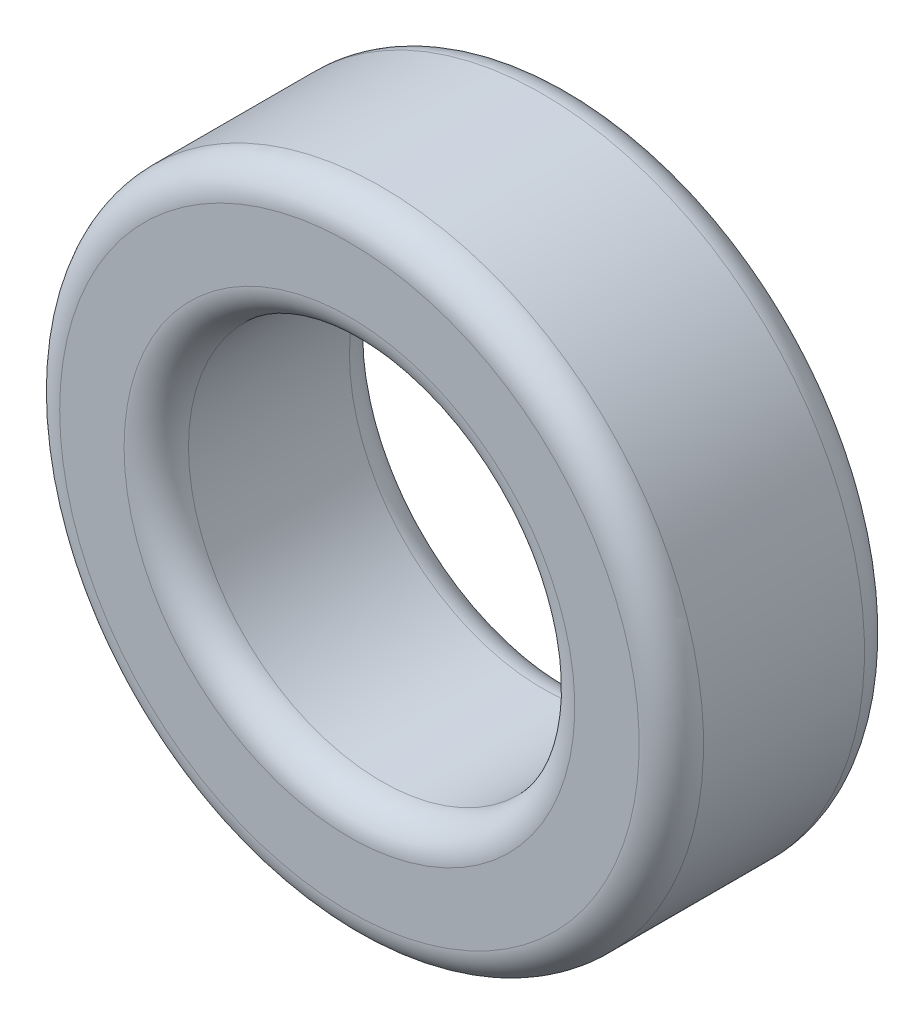
ISO-10303-21;
HEADER;
FILE_DESCRIPTION(('STEP AP214'),'2;1');
FILE_NAME('part.step','',(''),(''),'','','');
FILE_SCHEMA(('AUTOMOTIVE_DESIGN { 1 0 10303 214 1 1 1 1 }'));
ENDSEC;
DATA;
#1=APPLICATION_CONTEXT('core data for automotive mechanical design processes');
#2=APPLICATION_PROTOCOL_DEFINITION('international standard','automotive_design',2000,#1);
#3=PRODUCT_CONTEXT('',#1,'mechanical');
#4=PRODUCT('Part','Part','',(#3));
#5=PRODUCT_RELATED_PRODUCT_CATEGORY('part','',(#4));
#6=PRODUCT_DEFINITION_FORMATION('','',#4);
#7=PRODUCT_DEFINITION_CONTEXT('part definition',#1,'design');
#8=PRODUCT_DEFINITION('design','',#6,#7);
#9=PRODUCT_DEFINITION_SHAPE('','',#8);
#10=(LENGTH_UNIT() NAMED_UNIT(*) SI_UNIT(.MILLI.,.METRE.));
#11=(NAMED_UNIT(*) PLANE_ANGLE_UNIT() SI_UNIT($,.RADIAN.));
#12=(NAMED_UNIT(*) SI_UNIT($,.STERADIAN.) SOLID_ANGLE_UNIT());
#13=UNCERTAINTY_MEASURE_WITH_UNIT(LENGTH_MEASURE(1.E-05),#10,'distance_accuracy_value','');
#14=(GEOMETRIC_REPRESENTATION_CONTEXT(3) GLOBAL_UNCERTAINTY_ASSIGNED_CONTEXT((#13)) GLOBAL_UNIT_ASSIGNED_CONTEXT((#10,
#11,#12)) REPRESENTATION_CONTEXT('',''));
#15=CARTESIAN_POINT('',(0.,0.,0.));
#16=DIRECTION('',(0.,0.,1.));
#17=DIRECTION('',(1.,0.,0.));
#18=AXIS2_PLACEMENT_3D('',#15,#16,#17);
#19=CARTESIAN_POINT('',(0.,0.,1.25));
#20=DIRECTION('',(0.,0.,-1.));
#21=DIRECTION('',(-1.,0.,0.));
#22=AXIS2_PLACEMENT_3D('',#19,#20,#21);
#23=TOROIDAL_SURFACE('',#22,3.5,0.5);
#24=CARTESIAN_POINT('',(0.,0.,1.25));
#25=DIRECTION('',(0.,0.,-1.));
#26=DIRECTION('',(-1.,0.,0.));
#27=AXIS2_PLACEMENT_3D('',#24,#25,#26);
#28=CIRCLE('',#27,3.);
#29=CARTESIAN_POINT('',(-3.,0.,1.25));
#30=VERTEX_POINT('',#29);
#31=EDGE_CURVE('E10',#30,#30,#28,.T.);
#32=ORIENTED_EDGE('',*,*,#31,.T.);
#33=EDGE_LOOP('',(#32));
#34=FACE_BOUND('',#33,.T.);
#35=CARTESIAN_POINT('',(0.,0.,1.75));
#36=DIRECTION('',(0.,0.,-1.));
#37=DIRECTION('',(-1.,0.,0.));
#38=AXIS2_PLACEMENT_3D('',#35,#36,#37);
#39=CIRCLE('',#38,3.5);
#40=CARTESIAN_POINT('',(-3.5,0.,1.75));
#41=VERTEX_POINT('',#40);
#42=EDGE_CURVE('E65',#41,#41,#39,.T.);
#43=ORIENTED_EDGE('',*,*,#42,.F.);
#44=EDGE_LOOP('',(#43));
#45=FACE_BOUND('',#44,.T.);
#46=ADVANCED_FACE('F37',(#34,#45),#23,.T.);
#47=CARTESIAN_POINT('',(0.,0.,0.));
#48=DIRECTION('',(0.,0.,-1.));
#49=DIRECTION('',(-1.,0.,0.));
#50=AXIS2_PLACEMENT_3D('',#47,#48,#49);
#51=CYLINDRICAL_SURFACE('',#50,3.);
#52=CARTESIAN_POINT('',(0.,0.,-1.24999999999999));
#53=DIRECTION('',(0.,0.,-1.));
#54=DIRECTION('',(-1.,0.,0.));
#55=AXIS2_PLACEMENT_3D('',#52,#53,#54);
#56=CIRCLE('',#55,3.);
#57=CARTESIAN_POINT('',(-3.,0.,-1.24999999999999));
#58=VERTEX_POINT('',#57);
#59=EDGE_CURVE('E43',#58,#58,#56,.T.);
#60=ORIENTED_EDGE('',*,*,#59,.T.);
#61=EDGE_LOOP('',(#60));
#62=FACE_BOUND('',#61,.T.);
#63=ORIENTED_EDGE('',*,*,#31,.F.);
#64=EDGE_LOOP('',(#63));
#65=FACE_BOUND('',#64,.T.);
#66=ADVANCED_FACE('F73',(#62,#65),#51,.F.);
#67=CARTESIAN_POINT('',(0.,0.,-1.25));
#68=DIRECTION('',(0.,0.,-1.));
#69=DIRECTION('',(-1.,0.,0.));
#70=AXIS2_PLACEMENT_3D('',#67,#68,#69);
#71=TOROIDAL_SURFACE('',#70,3.5,0.5);
#72=CARTESIAN_POINT('',(0.,0.,-1.75));
#73=DIRECTION('',(0.,0.,-1.));
#74=DIRECTION('',(-1.,0.,0.));
#75=AXIS2_PLACEMENT_3D('',#72,#73,#74);
#76=CIRCLE('',#75,3.5);
#77=CARTESIAN_POINT('',(-3.5,0.,-1.75));
#78=VERTEX_POINT('',#77);
#79=EDGE_CURVE('E47',#78,#78,#76,.T.);
#80=ORIENTED_EDGE('',*,*,#79,.T.);
#81=EDGE_LOOP('',(#80));
#82=FACE_BOUND('',#81,.T.);
#83=ORIENTED_EDGE('',*,*,#59,.F.);
#84=EDGE_LOOP('',(#83));
#85=FACE_BOUND('',#84,.T.);
#86=ADVANCED_FACE('F77',(#82,#85),#71,.T.);
#87=CARTESIAN_POINT('',(0.,4.5,-1.75));
#88=DIRECTION('',(0.,0.,-1.));
#89=DIRECTION('',(-1.,0.,0.));
#90=AXIS2_PLACEMENT_3D('',#87,#88,#89);
#91=PLANE('',#90);
#92=CARTESIAN_POINT('',(0.,0.,-1.75));
#93=DIRECTION('',(0.,0.,-1.));
#94=DIRECTION('',(-1.,0.,0.));
#95=AXIS2_PLACEMENT_3D('',#92,#93,#94);
#96=CIRCLE('',#95,4.5);
#97=CARTESIAN_POINT('',(-4.5,0.,-1.75));
#98=VERTEX_POINT('',#97);
#99=EDGE_CURVE('E51',#98,#98,#96,.T.);
#100=ORIENTED_EDGE('',*,*,#99,.T.);
#101=EDGE_LOOP('',(#100));
#102=FACE_BOUND('',#101,.T.);
#103=ORIENTED_EDGE('',*,*,#79,.F.);
#104=EDGE_LOOP('',(#103));
#105=FACE_BOUND('',#104,.T.);
#106=ADVANCED_FACE('F81',(#102,#105),#91,.T.);
#107=CARTESIAN_POINT('',(0.,0.,-1.25));
#108=DIRECTION('',(0.,0.,-1.));
#109=DIRECTION('',(-1.,0.,0.));
#110=AXIS2_PLACEMENT_3D('',#107,#108,#109);
#111=TOROIDAL_SURFACE('',#110,4.5,0.5);
#112=CARTESIAN_POINT('',(0.,0.,-1.24999999999999));
#113=DIRECTION('',(0.,0.,-1.));
#114=DIRECTION('',(-1.,0.,0.));
#115=AXIS2_PLACEMENT_3D('',#112,#113,#114);
#116=CIRCLE('',#115,5.);
#117=CARTESIAN_POINT('',(-5.,0.,-1.24999999999999));
#118=VERTEX_POINT('',#117);
#119=EDGE_CURVE('E56',#118,#118,#116,.T.);
#120=ORIENTED_EDGE('',*,*,#119,.T.);
#121=EDGE_LOOP('',(#120));
#122=FACE_BOUND('',#121,.T.);
#123=ORIENTED_EDGE('',*,*,#99,.F.);
#124=EDGE_LOOP('',(#123));
#125=FACE_BOUND('',#124,.T.);
#126=ADVANCED_FACE('F88',(#122,#125),#111,.T.);
#127=CARTESIAN_POINT('',(0.,0.,0.));
#128=DIRECTION('',(0.,0.,-1.));
#129=DIRECTION('',(-1.,0.,0.));
#130=AXIS2_PLACEMENT_3D('',#127,#128,#129);
#131=CYLINDRICAL_SURFACE('',#130,5.);
#132=CARTESIAN_POINT('',(0.,0.,1.25));
#133=DIRECTION('',(0.,0.,-1.));
#134=DIRECTION('',(-1.,0.,0.));
#135=AXIS2_PLACEMENT_3D('',#132,#133,#134);
#136=CIRCLE('',#135,5.);
#137=CARTESIAN_POINT('',(-5.,0.,1.25));
#138=VERTEX_POINT('',#137);
#139=EDGE_CURVE('E59',#138,#138,#136,.T.);
#140=ORIENTED_EDGE('',*,*,#139,.T.);
#141=EDGE_LOOP('',(#140));
#142=FACE_BOUND('',#141,.T.);
#143=ORIENTED_EDGE('',*,*,#119,.F.);
#144=EDGE_LOOP('',(#143));
#145=FACE_BOUND('',#144,.T.);
#146=ADVANCED_FACE('F92',(#142,#145),#131,.T.);
#147=CARTESIAN_POINT('',(0.,0.,1.25));
#148=DIRECTION('',(0.,0.,-1.));
#149=DIRECTION('',(-1.,0.,0.));
#150=AXIS2_PLACEMENT_3D('',#147,#148,#149);
#151=TOROIDAL_SURFACE('',#150,4.5,0.5);
#152=CARTESIAN_POINT('',(0.,0.,1.75));
#153=DIRECTION('',(0.,0.,-1.));
#154=DIRECTION('',(-1.,0.,0.));
#155=AXIS2_PLACEMENT_3D('',#152,#153,#154);
#156=CIRCLE('',#155,4.5);
#157=CARTESIAN_POINT('',(-4.5,0.,1.75));
#158=VERTEX_POINT('',#157);
#159=EDGE_CURVE('E62',#158,#158,#156,.T.);
#160=ORIENTED_EDGE('',*,*,#159,.T.);
#161=EDGE_LOOP('',(#160));
#162=FACE_BOUND('',#161,.T.);
#163=ORIENTED_EDGE('',*,*,#139,.F.);
#164=EDGE_LOOP('',(#163));
#165=FACE_BOUND('',#164,.T.);
#166=ADVANCED_FACE('F96',(#162,#165),#151,.T.);
#167=CARTESIAN_POINT('',(0.,4.5,1.75));
#168=DIRECTION('',(0.,0.,1.));
#169=DIRECTION('',(1.,0.,0.));
#170=AXIS2_PLACEMENT_3D('',#167,#168,#169);
#171=PLANE('',#170);
#172=ORIENTED_EDGE('',*,*,#42,.T.);
#173=EDGE_LOOP('',(#172));
#174=FACE_BOUND('',#173,.T.);
#175=ORIENTED_EDGE('',*,*,#159,.F.);
#176=EDGE_LOOP('',(#175));
#177=FACE_BOUND('',#176,.T.);
#178=ADVANCED_FACE('F69',(#174,#177),#171,.T.);
#179=CLOSED_SHELL('',(#46,#66,#86,#106,#126,#146,#166,#178));
#180=MANIFOLD_SOLID_BREP('B2',#179);
#181=ADVANCED_BREP_SHAPE_REPRESENTATION('',(#18,#180),#14);
#182=SHAPE_DEFINITION_REPRESENTATION(#9,#181);
ENDSEC;
END-ISO-10303-21;
